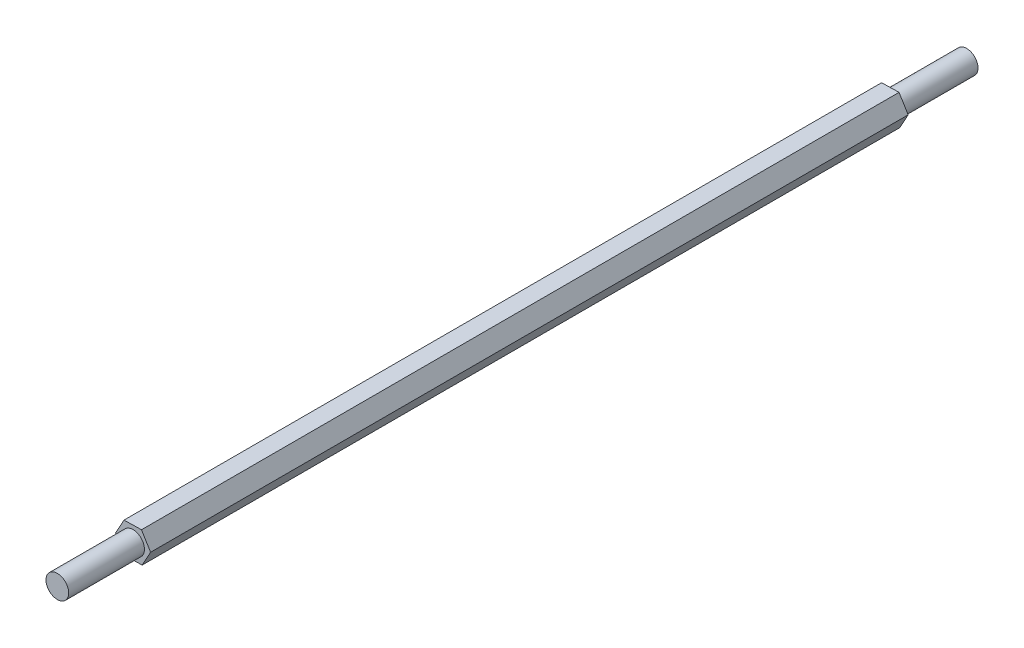
ISO-10303-21;
HEADER;
FILE_DESCRIPTION(('STEP AP214'),'2;1');
FILE_NAME('part.step','',(''),(''),'','','');
FILE_SCHEMA(('AUTOMOTIVE_DESIGN { 1 0 10303 214 1 1 1 1 }'));
ENDSEC;
DATA;
#1=APPLICATION_CONTEXT('core data for automotive mechanical design processes');
#2=APPLICATION_PROTOCOL_DEFINITION('international standard','automotive_design',2000,#1);
#3=PRODUCT_CONTEXT('',#1,'mechanical');
#4=PRODUCT('Part','Part','',(#3));
#5=PRODUCT_RELATED_PRODUCT_CATEGORY('part','',(#4));
#6=PRODUCT_DEFINITION_FORMATION('','',#4);
#7=PRODUCT_DEFINITION_CONTEXT('part definition',#1,'design');
#8=PRODUCT_DEFINITION('design','',#6,#7);
#9=PRODUCT_DEFINITION_SHAPE('','',#8);
#10=(LENGTH_UNIT() NAMED_UNIT(*) SI_UNIT(.MILLI.,.METRE.));
#11=(NAMED_UNIT(*) PLANE_ANGLE_UNIT() SI_UNIT($,.RADIAN.));
#12=(NAMED_UNIT(*) SI_UNIT($,.STERADIAN.) SOLID_ANGLE_UNIT());
#13=UNCERTAINTY_MEASURE_WITH_UNIT(LENGTH_MEASURE(1.E-05),#10,'distance_accuracy_value','');
#14=(GEOMETRIC_REPRESENTATION_CONTEXT(3) GLOBAL_UNCERTAINTY_ASSIGNED_CONTEXT((#13)) GLOBAL_UNIT_ASSIGNED_CONTEXT((#10,
#11,#12)) REPRESENTATION_CONTEXT('',''));
#15=CARTESIAN_POINT('',(0.,0.,0.));
#16=DIRECTION('',(0.,0.,1.));
#17=DIRECTION('',(1.,0.,0.));
#18=AXIS2_PLACEMENT_3D('',#15,#16,#17);
#19=CARTESIAN_POINT('',(-17.3774900023392,3.57265736038529,100.));
#20=DIRECTION('',(-0.854819460608796,-0.518925514659366,0.));
#21=DIRECTION('',(0.518925514659366,-0.854819460608796,0.));
#22=AXIS2_PLACEMENT_3D('',#19,#20,#21);
#23=PLANE('',#22);
#24=DIRECTION('',(-0.518925514659366,0.854819460608796,0.));
#25=VECTOR('',#24,1.);
#26=CARTESIAN_POINT('',(-17.3774900023392,3.57265736038529,0.));
#27=LINE('',#26,#25);
#28=CARTESIAN_POINT('',(-17.3774900023392,3.57265736038529,0.));
#29=VERTEX_POINT('',#28);
#30=CARTESIAN_POINT('',(-18.575897144651,5.54677834314936,0.));
#31=VERTEX_POINT('',#30);
#32=EDGE_CURVE('E131',#29,#31,#27,.T.);
#33=ORIENTED_EDGE('',*,*,#32,.T.);
#34=DIRECTION('',(0.,0.,-1.));
#35=VECTOR('',#34,1.);
#36=CARTESIAN_POINT('',(-18.575897144651,5.54677834314936,100.));
#37=LINE('',#36,#35);
#38=CARTESIAN_POINT('',(-18.575897144651,5.54677834314936,100.));
#39=VERTEX_POINT('',#38);
#40=EDGE_CURVE('E42',#39,#31,#37,.T.);
#41=ORIENTED_EDGE('',*,*,#40,.F.);
#42=DIRECTION('',(-0.518925514659366,0.854819460608796,0.));
#43=VECTOR('',#42,1.);
#44=CARTESIAN_POINT('',(-17.3774900023392,3.57265736038529,100.));
#45=LINE('',#44,#43);
#46=CARTESIAN_POINT('',(-17.3774900023392,3.57265736038529,100.));
#47=VERTEX_POINT('',#46);
#48=EDGE_CURVE('E148',#47,#39,#45,.T.);
#49=ORIENTED_EDGE('',*,*,#48,.F.);
#50=DIRECTION('',(0.,0.,-1.));
#51=VECTOR('',#50,1.);
#52=CARTESIAN_POINT('',(-17.3774900023392,3.57265736038529,100.));
#53=LINE('',#52,#51);
#54=EDGE_CURVE('E127',#47,#29,#53,.T.);
#55=ORIENTED_EDGE('',*,*,#54,.T.);
#56=EDGE_LOOP('',(#33,#41,#49,#55));
#57=FACE_BOUND('',#56,.T.);
#58=ADVANCED_FACE('F39',(#57),#23,.F.);
#59=CARTESIAN_POINT('',(-18.575897144651,5.54677834314936,100.));
#60=DIRECTION('',(0.021992948062527,-0.999758125866211,0.));
#61=DIRECTION('',(0.999758125866211,0.021992948062527,0.));
#62=AXIS2_PLACEMENT_3D('',#59,#60,#61);
#63=PLANE('',#62);
#64=DIRECTION('',(-0.999758125866211,-0.021992948062527,0.));
#65=VECTOR('',#64,1.);
#66=CARTESIAN_POINT('',(-18.575897144651,5.54677834314936,0.));
#67=LINE('',#66,#65);
#68=CARTESIAN_POINT('',(-20.8847396370245,5.49598780521267,0.));
#69=VERTEX_POINT('',#68);
#70=EDGE_CURVE('E135',#31,#69,#67,.T.);
#71=ORIENTED_EDGE('',*,*,#70,.T.);
#72=DIRECTION('',(0.,0.,-1.));
#73=VECTOR('',#72,1.);
#74=CARTESIAN_POINT('',(-20.8847396370245,5.49598780521267,100.));
#75=LINE('',#74,#73);
#76=CARTESIAN_POINT('',(-20.8847396370245,5.49598780521267,100.));
#77=VERTEX_POINT('',#76);
#78=EDGE_CURVE('E154',#77,#69,#75,.T.);
#79=ORIENTED_EDGE('',*,*,#78,.F.);
#80=DIRECTION('',(-0.999758125866211,-0.021992948062527,0.));
#81=VECTOR('',#80,1.);
#82=CARTESIAN_POINT('',(-18.575897144651,5.54677834314936,100.));
#83=LINE('',#82,#81);
#84=EDGE_CURVE('E96',#39,#77,#83,.T.);
#85=ORIENTED_EDGE('',*,*,#84,.F.);
#86=ORIENTED_EDGE('',*,*,#40,.T.);
#87=EDGE_LOOP('',(#71,#79,#85,#86));
#88=FACE_BOUND('',#87,.T.);
#89=ADVANCED_FACE('F208',(#88),#63,.F.);
#90=CARTESIAN_POINT('',(-20.8847396370245,5.49598780521267,100.));
#91=DIRECTION('',(0.876812408671323,-0.480832611206844,0.));
#92=DIRECTION('',(0.480832611206844,0.876812408671323,0.));
#93=AXIS2_PLACEMENT_3D('',#90,#91,#92);
#94=PLANE('',#93);
#95=DIRECTION('',(-0.480832611206844,-0.876812408671323,0.));
#96=VECTOR('',#95,1.);
#97=CARTESIAN_POINT('',(-20.8847396370245,5.49598780521267,0.));
#98=LINE('',#97,#96);
#99=CARTESIAN_POINT('',(-21.9951749870862,3.4710762845119,0.));
#100=VERTEX_POINT('',#99);
#101=EDGE_CURVE('E139',#69,#100,#98,.T.);
#102=ORIENTED_EDGE('',*,*,#101,.T.);
#103=DIRECTION('',(0.,0.,-1.));
#104=VECTOR('',#103,1.);
#105=CARTESIAN_POINT('',(-21.9951749870862,3.4710762845119,100.));
#106=LINE('',#105,#104);
#107=CARTESIAN_POINT('',(-21.9951749870862,3.4710762845119,100.));
#108=VERTEX_POINT('',#107);
#109=EDGE_CURVE('E120',#108,#100,#106,.T.);
#110=ORIENTED_EDGE('',*,*,#109,.F.);
#111=DIRECTION('',(-0.480832611206844,-0.876812408671323,0.));
#112=VECTOR('',#111,1.);
#113=CARTESIAN_POINT('',(-20.8847396370245,5.49598780521267,100.));
#114=LINE('',#113,#112);
#115=EDGE_CURVE('E109',#77,#108,#114,.T.);
#116=ORIENTED_EDGE('',*,*,#115,.F.);
#117=ORIENTED_EDGE('',*,*,#78,.T.);
#118=EDGE_LOOP('',(#102,#110,#116,#117));
#119=FACE_BOUND('',#118,.T.);
#120=ADVANCED_FACE('F212',(#119),#94,.F.);
#121=CARTESIAN_POINT('',(-21.9951749870862,3.4710762845119,100.));
#122=DIRECTION('',(0.854819460608796,0.518925514659365,0.));
#123=DIRECTION('',(-0.518925514659365,0.854819460608796,0.));
#124=AXIS2_PLACEMENT_3D('',#121,#122,#123);
#125=PLANE('',#124);
#126=DIRECTION('',(0.518925514659365,-0.854819460608796,0.));
#127=VECTOR('',#126,1.);
#128=CARTESIAN_POINT('',(-21.9951749870862,3.4710762845119,0.));
#129=LINE('',#128,#127);
#130=CARTESIAN_POINT('',(-20.7967678447744,1.49695530174782,0.));
#131=VERTEX_POINT('',#130);
#132=EDGE_CURVE('E118',#100,#131,#129,.T.);
#133=ORIENTED_EDGE('',*,*,#132,.T.);
#134=DIRECTION('',(0.,0.,-1.));
#135=VECTOR('',#134,1.);
#136=CARTESIAN_POINT('',(-20.7967678447744,1.49695530174782,100.));
#137=LINE('',#136,#135);
#138=CARTESIAN_POINT('',(-20.7967678447744,1.49695530174782,100.));
#139=VERTEX_POINT('',#138);
#140=EDGE_CURVE('E115',#139,#131,#137,.T.);
#141=ORIENTED_EDGE('',*,*,#140,.F.);
#142=DIRECTION('',(0.518925514659365,-0.854819460608796,0.));
#143=VECTOR('',#142,1.);
#144=CARTESIAN_POINT('',(-21.9951749870862,3.4710762845119,100.));
#145=LINE('',#144,#143);
#146=EDGE_CURVE('E103',#108,#139,#145,.T.);
#147=ORIENTED_EDGE('',*,*,#146,.F.);
#148=ORIENTED_EDGE('',*,*,#109,.T.);
#149=EDGE_LOOP('',(#133,#141,#147,#148));
#150=FACE_BOUND('',#149,.T.);
#151=ADVANCED_FACE('F116',(#150),#125,.F.);
#152=CARTESIAN_POINT('',(-20.7967678447744,1.49695530174782,100.));
#153=DIRECTION('',(-0.0219929480625272,0.999758125866211,0.));
#154=DIRECTION('',(-0.999758125866211,-0.0219929480625272,0.));
#155=AXIS2_PLACEMENT_3D('',#152,#153,#154);
#156=PLANE('',#155);
#157=DIRECTION('',(0.999758125866211,0.0219929480625272,0.));
#158=VECTOR('',#157,1.);
#159=CARTESIAN_POINT('',(-20.7967678447744,1.49695530174782,0.));
#160=LINE('',#159,#158);
#161=CARTESIAN_POINT('',(-18.4879253524009,1.54774583968452,0.));
#162=VERTEX_POINT('',#161);
#163=EDGE_CURVE('E81',#131,#162,#160,.T.);
#164=ORIENTED_EDGE('',*,*,#163,.T.);
#165=DIRECTION('',(0.,0.,-1.));
#166=VECTOR('',#165,1.);
#167=CARTESIAN_POINT('',(-18.4879253524009,1.54774583968452,100.));
#168=LINE('',#167,#166);
#169=CARTESIAN_POINT('',(-18.4879253524009,1.54774583968452,100.));
#170=VERTEX_POINT('',#169);
#171=EDGE_CURVE('E121',#170,#162,#168,.T.);
#172=ORIENTED_EDGE('',*,*,#171,.F.);
#173=DIRECTION('',(0.999758125866211,0.0219929480625272,0.));
#174=VECTOR('',#173,1.);
#175=CARTESIAN_POINT('',(-20.7967678447744,1.49695530174782,100.));
#176=LINE('',#175,#174);
#177=EDGE_CURVE('E107',#139,#170,#176,.T.);
#178=ORIENTED_EDGE('',*,*,#177,.F.);
#179=ORIENTED_EDGE('',*,*,#140,.T.);
#180=EDGE_LOOP('',(#164,#172,#178,#179));
#181=FACE_BOUND('',#180,.T.);
#182=ADVANCED_FACE('F123',(#181),#156,.F.);
#183=CARTESIAN_POINT('',(-18.4879253524009,1.54774583968452,100.));
#184=DIRECTION('',(-0.876812408671323,0.480832611206845,0.));
#185=DIRECTION('',(-0.480832611206845,-0.876812408671323,0.));
#186=AXIS2_PLACEMENT_3D('',#183,#184,#185);
#187=PLANE('',#186);
#188=DIRECTION('',(0.480832611206845,0.876812408671323,0.));
#189=VECTOR('',#188,1.);
#190=CARTESIAN_POINT('',(-18.4879253524009,1.54774583968452,0.));
#191=LINE('',#190,#189);
#192=EDGE_CURVE('E87',#162,#29,#191,.T.);
#193=ORIENTED_EDGE('',*,*,#192,.T.);
#194=ORIENTED_EDGE('',*,*,#54,.F.);
#195=DIRECTION('',(0.480832611206845,0.876812408671323,0.));
#196=VECTOR('',#195,1.);
#197=CARTESIAN_POINT('',(-18.4879253524009,1.54774583968452,100.));
#198=LINE('',#197,#196);
#199=EDGE_CURVE('E58',#170,#47,#198,.T.);
#200=ORIENTED_EDGE('',*,*,#199,.F.);
#201=ORIENTED_EDGE('',*,*,#171,.T.);
#202=EDGE_LOOP('',(#193,#194,#200,#201));
#203=FACE_BOUND('',#202,.T.);
#204=ADVANCED_FACE('F197',(#203),#187,.F.);
#205=CARTESIAN_POINT('',(0.,0.,100.));
#206=DIRECTION('',(0.,0.,1.));
#207=DIRECTION('',(1.,0.,0.));
#208=AXIS2_PLACEMENT_3D('',#205,#206,#207);
#209=PLANE('',#208);
#210=CARTESIAN_POINT('',(-19.683896115383,3.50583966198672,100.));
#211=DIRECTION('',(0.,0.,1.));
#212=DIRECTION('',(1.,0.,0.));
#213=AXIS2_PLACEMENT_3D('',#210,#211,#212);
#214=CIRCLE('',#213,1.5);
#215=CARTESIAN_POINT('',(-18.183896115383,3.50583966198672,100.));
#216=VERTEX_POINT('',#215);
#217=EDGE_CURVE('E49',#216,#216,#214,.T.);
#218=ORIENTED_EDGE('',*,*,#217,.F.);
#219=EDGE_LOOP('',(#218));
#220=FACE_BOUND('',#219,.T.);
#221=ORIENTED_EDGE('',*,*,#48,.T.);
#222=ORIENTED_EDGE('',*,*,#84,.T.);
#223=ORIENTED_EDGE('',*,*,#115,.T.);
#224=ORIENTED_EDGE('',*,*,#146,.T.);
#225=ORIENTED_EDGE('',*,*,#177,.T.);
#226=ORIENTED_EDGE('',*,*,#199,.T.);
#227=EDGE_LOOP('',(#221,#222,#223,#224,#225,#226));
#228=FACE_BOUND('',#227,.T.);
#229=ADVANCED_FACE('F105',(#220,#228),#209,.T.);
#230=CARTESIAN_POINT('',(0.,0.,0.));
#231=DIRECTION('',(0.,0.,1.));
#232=DIRECTION('',(1.,0.,0.));
#233=AXIS2_PLACEMENT_3D('',#230,#231,#232);
#234=PLANE('',#233);
#235=CARTESIAN_POINT('',(-19.6537857624306,3.5324517422579,0.));
#236=DIRECTION('',(0.,0.,-1.));
#237=DIRECTION('',(-1.,0.,0.));
#238=AXIS2_PLACEMENT_3D('',#235,#236,#237);
#239=CIRCLE('',#238,1.5);
#240=CARTESIAN_POINT('',(-21.1537857624306,3.5324517422579,0.));
#241=VERTEX_POINT('',#240);
#242=EDGE_CURVE('E11',#241,#241,#239,.T.);
#243=ORIENTED_EDGE('',*,*,#242,.F.);
#244=EDGE_LOOP('',(#243));
#245=FACE_BOUND('',#244,.T.);
#246=ORIENTED_EDGE('',*,*,#32,.F.);
#247=ORIENTED_EDGE('',*,*,#192,.F.);
#248=ORIENTED_EDGE('',*,*,#163,.F.);
#249=ORIENTED_EDGE('',*,*,#132,.F.);
#250=ORIENTED_EDGE('',*,*,#101,.F.);
#251=ORIENTED_EDGE('',*,*,#70,.F.);
#252=EDGE_LOOP('',(#246,#247,#248,#249,#250,#251));
#253=FACE_BOUND('',#252,.T.);
#254=ADVANCED_FACE('F189',(#245,#253),#234,.F.);
#255=CARTESIAN_POINT('',(-19.683896115383,3.50583966198672,110.));
#256=DIRECTION('',(0.,0.,-1.));
#257=DIRECTION('',(-1.,0.,0.));
#258=AXIS2_PLACEMENT_3D('',#255,#256,#257);
#259=CYLINDRICAL_SURFACE('',#258,1.5);
#260=CARTESIAN_POINT('',(-19.683896115383,3.50583966198672,110.));
#261=DIRECTION('',(0.,0.,1.));
#262=DIRECTION('',(1.,0.,0.));
#263=AXIS2_PLACEMENT_3D('',#260,#261,#262);
#264=CIRCLE('',#263,1.5);
#265=CARTESIAN_POINT('',(-18.183896115383,3.50583966198672,110.));
#266=VERTEX_POINT('',#265);
#267=EDGE_CURVE('E136',#266,#266,#264,.T.);
#268=ORIENTED_EDGE('',*,*,#267,.F.);
#269=EDGE_LOOP('',(#268));
#270=FACE_BOUND('',#269,.T.);
#271=ORIENTED_EDGE('',*,*,#217,.T.);
#272=EDGE_LOOP('',(#271));
#273=FACE_BOUND('',#272,.T.);
#274=ADVANCED_FACE('F192',(#270,#273),#259,.T.);
#275=CARTESIAN_POINT('',(-19.683896115383,3.50583966198672,110.));
#276=DIRECTION('',(0.,0.,1.));
#277=DIRECTION('',(1.,0.,0.));
#278=AXIS2_PLACEMENT_3D('',#275,#276,#277);
#279=PLANE('',#278);
#280=ORIENTED_EDGE('',*,*,#267,.T.);
#281=EDGE_LOOP('',(#280));
#282=FACE_BOUND('',#281,.T.);
#283=ADVANCED_FACE('F185',(#282),#279,.T.);
#284=CARTESIAN_POINT('',(-19.6537857624306,3.5324517422579,-10.));
#285=DIRECTION('',(0.,0.,1.));
#286=DIRECTION('',(1.,0.,0.));
#287=AXIS2_PLACEMENT_3D('',#284,#285,#286);
#288=CYLINDRICAL_SURFACE('',#287,1.5);
#289=CARTESIAN_POINT('',(-19.6537857624306,3.5324517422579,-10.));
#290=DIRECTION('',(0.,0.,-1.));
#291=DIRECTION('',(-1.,0.,0.));
#292=AXIS2_PLACEMENT_3D('',#289,#290,#291);
#293=CIRCLE('',#292,1.5);
#294=CARTESIAN_POINT('',(-21.1537857624306,3.5324517422579,-10.));
#295=VERTEX_POINT('',#294);
#296=EDGE_CURVE('E175',#295,#295,#293,.T.);
#297=ORIENTED_EDGE('',*,*,#296,.F.);
#298=EDGE_LOOP('',(#297));
#299=FACE_BOUND('',#298,.T.);
#300=ORIENTED_EDGE('',*,*,#242,.T.);
#301=EDGE_LOOP('',(#300));
#302=FACE_BOUND('',#301,.T.);
#303=ADVANCED_FACE('F182',(#299,#302),#288,.T.);
#304=CARTESIAN_POINT('',(-19.6537857624306,3.5324517422579,-10.));
#305=DIRECTION('',(0.,0.,-1.));
#306=DIRECTION('',(-1.,0.,0.));
#307=AXIS2_PLACEMENT_3D('',#304,#305,#306);
#308=PLANE('',#307);
#309=ORIENTED_EDGE('',*,*,#296,.T.);
#310=EDGE_LOOP('',(#309));
#311=FACE_BOUND('',#310,.T.);
#312=ADVANCED_FACE('F180',(#311),#308,.T.);
#313=CLOSED_SHELL('',(#58,#89,#120,#151,#182,#204,#229,#254,#274,#283,#303,#312));
#314=MANIFOLD_SOLID_BREP('B2',#313);
#315=ADVANCED_BREP_SHAPE_REPRESENTATION('',(#18,#314),#14);
#316=SHAPE_DEFINITION_REPRESENTATION(#9,#315);
ENDSEC;
END-ISO-10303-21;
